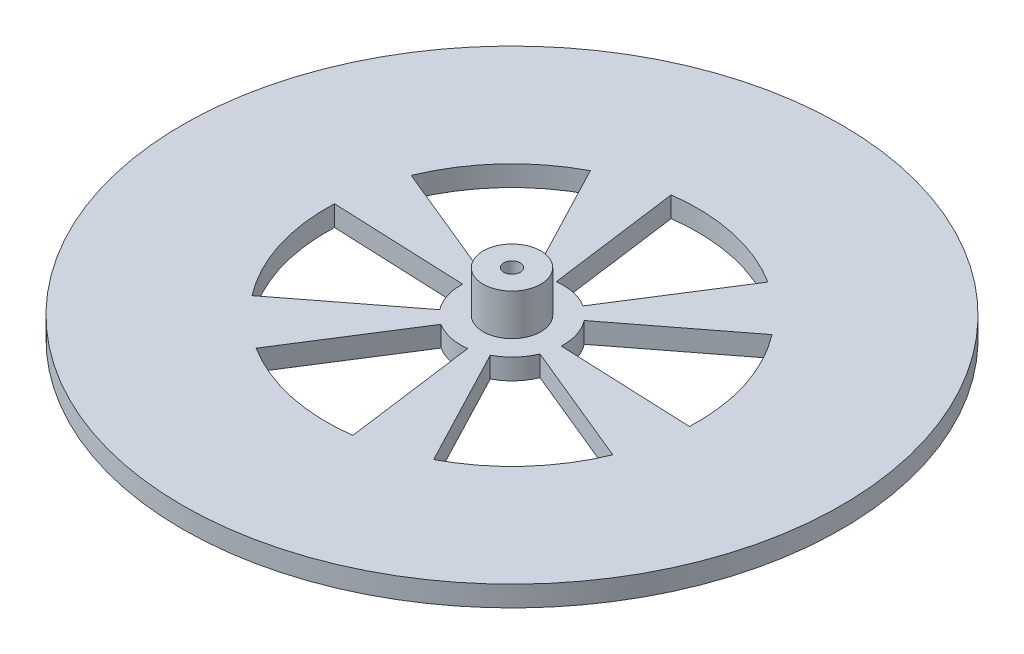
ISO-10303-21;
HEADER;
FILE_DESCRIPTION(('STEP AP214'),'2;1');
FILE_NAME('part.step','',(''),(''),'','','');
FILE_SCHEMA(('AUTOMOTIVE_DESIGN { 1 0 10303 214 1 1 1 1 }'));
ENDSEC;
DATA;
#1=APPLICATION_CONTEXT('core data for automotive mechanical design processes');
#2=APPLICATION_PROTOCOL_DEFINITION('international standard','automotive_design',2000,#1);
#3=PRODUCT_CONTEXT('',#1,'mechanical');
#4=PRODUCT('Part','Part','',(#3));
#5=PRODUCT_RELATED_PRODUCT_CATEGORY('part','',(#4));
#6=PRODUCT_DEFINITION_FORMATION('','',#4);
#7=PRODUCT_DEFINITION_CONTEXT('part definition',#1,'design');
#8=PRODUCT_DEFINITION('design','',#6,#7);
#9=PRODUCT_DEFINITION_SHAPE('','',#8);
#10=(LENGTH_UNIT() NAMED_UNIT(*) SI_UNIT(.MILLI.,.METRE.));
#11=(NAMED_UNIT(*) PLANE_ANGLE_UNIT() SI_UNIT($,.RADIAN.));
#12=(NAMED_UNIT(*) SI_UNIT($,.STERADIAN.) SOLID_ANGLE_UNIT());
#13=UNCERTAINTY_MEASURE_WITH_UNIT(LENGTH_MEASURE(1.E-05),#10,'distance_accuracy_value','');
#14=(GEOMETRIC_REPRESENTATION_CONTEXT(3) GLOBAL_UNCERTAINTY_ASSIGNED_CONTEXT((#13)) GLOBAL_UNIT_ASSIGNED_CONTEXT((#10,
#11,#12)) REPRESENTATION_CONTEXT('',''));
#15=CARTESIAN_POINT('',(0.,0.,0.));
#16=DIRECTION('',(0.,0.,1.));
#17=DIRECTION('',(1.,0.,0.));
#18=AXIS2_PLACEMENT_3D('',#15,#16,#17);
#19=CARTESIAN_POINT('',(0.,5.,0.));
#20=DIRECTION('',(0.,-1.,0.));
#21=DIRECTION('',(0.,0.,-1.));
#22=AXIS2_PLACEMENT_3D('',#19,#20,#21);
#23=CYLINDRICAL_SURFACE('',#22,80.);
#24=CARTESIAN_POINT('',(0.,5.,0.));
#25=DIRECTION('',(0.,1.,0.));
#26=DIRECTION('',(0.,0.,1.));
#27=AXIS2_PLACEMENT_3D('',#24,#25,#26);
#28=CIRCLE('',#27,80.);
#29=CARTESIAN_POINT('',(0.,5.,80.));
#30=VERTEX_POINT('',#29);
#31=EDGE_CURVE('E44',#30,#30,#28,.T.);
#32=ORIENTED_EDGE('',*,*,#31,.F.);
#33=EDGE_LOOP('',(#32));
#34=FACE_BOUND('',#33,.T.);
#35=CARTESIAN_POINT('',(0.,0.,0.));
#36=DIRECTION('',(0.,1.,0.));
#37=DIRECTION('',(0.,0.,1.));
#38=AXIS2_PLACEMENT_3D('',#35,#36,#37);
#39=CIRCLE('',#38,80.);
#40=CARTESIAN_POINT('',(0.,0.,80.));
#41=VERTEX_POINT('',#40);
#42=EDGE_CURVE('E394',#41,#41,#39,.T.);
#43=ORIENTED_EDGE('',*,*,#42,.T.);
#44=EDGE_LOOP('',(#43));
#45=FACE_BOUND('',#44,.T.);
#46=ADVANCED_FACE('F37',(#34,#45),#23,.T.);
#47=CARTESIAN_POINT('',(0.,5.,0.));
#48=DIRECTION('',(0.,1.,0.));
#49=DIRECTION('',(0.,0.,1.));
#50=AXIS2_PLACEMENT_3D('',#47,#48,#49);
#51=PLANE('',#50);
#52=CARTESIAN_POINT('',(0.,5.,0.));
#53=DIRECTION('',(0.,1.,0.));
#54=DIRECTION('',(0.,0.,1.));
#55=AXIS2_PLACEMENT_3D('',#52,#53,#54);
#56=CIRCLE('',#55,7.);
#57=CARTESIAN_POINT('',(0.,5.,7.));
#58=VERTEX_POINT('',#57);
#59=EDGE_CURVE('E228',#58,#58,#56,.T.);
#60=ORIENTED_EDGE('',*,*,#59,.F.);
#61=EDGE_LOOP('',(#60));
#62=FACE_BOUND('',#61,.T.);
#63=CARTESIAN_POINT('',(-1.30924006846535E-12,5.,4.21924539447631E-13));
#64=DIRECTION('',(0.,1.,0.));
#65=DIRECTION('',(-0.866025403784443,0.,-0.499999999999992));
#66=AXIS2_PLACEMENT_3D('',#63,#64,#65);
#67=CIRCLE('',#66,45.0000000000013);
#68=CARTESIAN_POINT('',(44.9608544646638,5.,1.87658354658616));
#69=VERTEX_POINT('',#68);
#70=CARTESIAN_POINT('',(35.648257372824,5.,-27.4627337728948));
#71=VERTEX_POINT('',#70);
#72=EDGE_CURVE('E51',#69,#71,#67,.T.);
#73=ORIENTED_EDGE('',*,*,#72,.F.);
#74=DIRECTION('',(0.999130099214752,0.,0.0417018565908037));
#75=VECTOR('',#74,1.);
#76=CARTESIAN_POINT('',(44.9608544646638,5.,1.87658354658616));
#77=LINE('',#76,#75);
#78=CARTESIAN_POINT('',(12.4891262401844,5.,0.52127320738505));
#79=VERTEX_POINT('',#78);
#80=EDGE_CURVE('E312',#79,#69,#77,.T.);
#81=ORIENTED_EDGE('',*,*,#80,.F.);
#82=CARTESIAN_POINT('',(-2.73442414232397E-13,5.,0.));
#83=DIRECTION('',(0.,-1.,0.));
#84=DIRECTION('',(-0.866025403784443,0.,-0.499999999999992));
#85=AXIS2_PLACEMENT_3D('',#82,#83,#84);
#86=CIRCLE('',#85,12.5000000000003);
#87=CARTESIAN_POINT('',(9.90229371467334,5.,-7.62853715913746));
#88=VERTEX_POINT('',#87);
#89=EDGE_CURVE('E326',#88,#79,#86,.T.);
#90=ORIENTED_EDGE('',*,*,#89,.F.);
#91=DIRECTION('',(-0.792183497173867,0.,0.610282972730996));
#92=VECTOR('',#91,1.);
#93=CARTESIAN_POINT('',(35.648257372824,5.,-27.4627337728948));
#94=LINE('',#93,#92);
#95=EDGE_CURVE('E323',#71,#88,#94,.T.);
#96=ORIENTED_EDGE('',*,*,#95,.F.);
#97=EDGE_LOOP('',(#73,#81,#90,#96));
#98=FACE_BOUND('',#97,.T.);
#99=CARTESIAN_POINT('',(-2.89222664590972E-13,5.,1.34479742866728E-12));
#100=DIRECTION('',(0.,1.,0.));
#101=DIRECTION('',(-0.866025403784433,0.,0.50000000000001));
#102=AXIS2_PLACEMENT_3D('',#99,#100,#101);
#103=CIRCLE('',#102,45.0000000000013);
#104=CARTESIAN_POINT('',(24.1055962559994,5.,-37.9989503689609));
#105=VERTEX_POINT('',#104);
#106=CARTESIAN_POINT('',(-5.95929641828389,5.,-44.6036633719589));
#107=VERTEX_POINT('',#106);
#108=EDGE_CURVE('E59',#105,#107,#103,.T.);
#109=ORIENTED_EDGE('',*,*,#108,.F.);
#110=DIRECTION('',(0.535679916799986,0.,-0.844421119310241));
#111=VECTOR('',#110,1.);
#112=CARTESIAN_POINT('',(24.1055962559994,5.,-37.9989503689609));
#113=LINE('',#112,#111);
#114=CARTESIAN_POINT('',(6.69599895999982,5.,-10.555263991378));
#115=VERTEX_POINT('',#114);
#116=EDGE_CURVE('E281',#115,#105,#113,.T.);
#117=ORIENTED_EDGE('',*,*,#116,.F.);
#118=CARTESIAN_POINT('',(0.,5.,2.81061848561384E-13));
#119=DIRECTION('',(0.,-1.,0.));
#120=DIRECTION('',(-0.866025403784433,0.,0.50000000000001));
#121=AXIS2_PLACEMENT_3D('',#118,#119,#120);
#122=CIRCLE('',#121,12.5000000000003);
#123=CARTESIAN_POINT('',(-1.65536011618997,5.,-12.3899064922108));
#124=VERTEX_POINT('',#123);
#125=EDGE_CURVE('E296',#124,#115,#122,.T.);
#126=ORIENTED_EDGE('',*,*,#125,.F.);
#127=DIRECTION('',(0.132428809295198,0.,0.991192519376865));
#128=VECTOR('',#127,1.);
#129=CARTESIAN_POINT('',(-5.9592964182839,5.,-44.6036633719589));
#130=LINE('',#129,#128);
#131=EDGE_CURVE('E292',#107,#124,#130,.T.);
#132=ORIENTED_EDGE('',*,*,#131,.F.);
#133=EDGE_LOOP('',(#109,#117,#126,#132));
#134=FACE_BOUND('',#133,.T.);
#135=CARTESIAN_POINT('',(2.89222664590981E-13,5.,-1.34479742866728E-12));
#136=DIRECTION('',(0.,1.,0.));
#137=DIRECTION('',(0.866025403784436,0.,-0.500000000000004));
#138=AXIS2_PLACEMENT_3D('',#135,#136,#137);
#139=CIRCLE('',#138,45.0000000000013);
#140=CARTESIAN_POINT('',(-24.1055962559996,5.,37.9989503689607));
#141=VERTEX_POINT('',#140);
#142=CARTESIAN_POINT('',(5.95929641828358,5.,44.603663371959));
#143=VERTEX_POINT('',#142);
#144=EDGE_CURVE('E241',#141,#143,#139,.T.);
#145=ORIENTED_EDGE('',*,*,#144,.F.);
#146=DIRECTION('',(-0.535679916799991,0.,0.844421119310238));
#147=VECTOR('',#146,1.);
#148=CARTESIAN_POINT('',(-24.1055962559996,5.,37.9989503689607));
#149=LINE('',#148,#147);
#150=CARTESIAN_POINT('',(-6.6959989599999,5.,10.555263991378));
#151=VERTEX_POINT('',#150);
#152=EDGE_CURVE('E249',#151,#141,#149,.T.);
#153=ORIENTED_EDGE('',*,*,#152,.F.);
#154=CARTESIAN_POINT('',(0.,5.,-2.81061848561384E-13));
#155=DIRECTION('',(0.,-1.,0.));
#156=DIRECTION('',(0.866025403784436,0.,-0.500000000000004));
#157=AXIS2_PLACEMENT_3D('',#154,#155,#156);
#158=CIRCLE('',#157,12.5000000000003);
#159=CARTESIAN_POINT('',(1.65536011618988,5.,12.3899064922108));
#160=VERTEX_POINT('',#159);
#161=EDGE_CURVE('E263',#160,#151,#158,.T.);
#162=ORIENTED_EDGE('',*,*,#161,.F.);
#163=DIRECTION('',(-0.132428809295191,0.,-0.991192519376866));
#164=VECTOR('',#163,1.);
#165=CARTESIAN_POINT('',(5.95929641828358,5.,44.603663371959));
#166=LINE('',#165,#164);
#167=EDGE_CURVE('E260',#143,#160,#166,.T.);
#168=ORIENTED_EDGE('',*,*,#167,.F.);
#169=EDGE_LOOP('',(#145,#153,#162,#168));
#170=FACE_BOUND('',#169,.T.);
#171=CARTESIAN_POINT('',(-1.02001740387436E-12,5.,-9.22872889219661E-13));
#172=DIRECTION('',(0.,1.,0.));
#173=DIRECTION('',(0.,0.,-1.));
#174=AXIS2_PLACEMENT_3D('',#171,#172,#173);
#175=CIRCLE('',#174,45.0000000000013);
#176=CARTESIAN_POINT('',(20.855258208664,5.,39.8755339155472));
#177=VERTEX_POINT('',#176);
#178=CARTESIAN_POINT('',(41.6075537911076,5.,17.1409295990645));
#179=VERTEX_POINT('',#178);
#180=EDGE_CURVE('E204',#177,#179,#175,.T.);
#181=ORIENTED_EDGE('',*,*,#180,.F.);
#182=DIRECTION('',(0.463450182414756,0.,0.886122975901048));
#183=VECTOR('',#182,1.);
#184=CARTESIAN_POINT('',(20.855258208664,5.,39.8755339155472));
#185=LINE('',#184,#183);
#186=CARTESIAN_POINT('',(5.79312728018445,5.,11.0765371987631));
#187=VERTEX_POINT('',#186);
#188=EDGE_CURVE('E222',#187,#177,#185,.T.);
#189=ORIENTED_EDGE('',*,*,#188,.F.);
#190=CARTESIAN_POINT('',(-2.13370987545147E-13,5.,-1.92554305833426E-13));
#191=DIRECTION('',(0.,-1.,0.));
#192=DIRECTION('',(0.,0.,-1.));
#193=AXIS2_PLACEMENT_3D('',#190,#191,#192);
#194=CIRCLE('',#193,12.5000000000003);
#195=CARTESIAN_POINT('',(11.5576538308632,5.,4.76136933307346));
#196=VERTEX_POINT('',#195);
#197=EDGE_CURVE('E225',#196,#187,#194,.T.);
#198=ORIENTED_EDGE('',*,*,#197,.F.);
#199=DIRECTION('',(-0.924612306469059,0.,-0.380909546645877));
#200=VECTOR('',#199,1.);
#201=CARTESIAN_POINT('',(41.6075537911076,5.,17.1409295990645));
#202=LINE('',#201,#200);
#203=EDGE_CURVE('E234',#179,#196,#202,.T.);
#204=ORIENTED_EDGE('',*,*,#203,.F.);
#205=EDGE_LOOP('',(#181,#189,#198,#204));
#206=FACE_BOUND('',#205,.T.);
#207=CARTESIAN_POINT('',(1.30924006846535E-12,5.,-4.21924539447622E-13));
#208=DIRECTION('',(0.,1.,0.));
#209=DIRECTION('',(0.86602540378444,0.,0.499999999999998));
#210=AXIS2_PLACEMENT_3D('',#207,#208,#209);
#211=CIRCLE('',#210,45.0000000000013);
#212=CARTESIAN_POINT('',(-44.9608544646638,5.,-1.87658354658648));
#213=VERTEX_POINT('',#212);
#214=CARTESIAN_POINT('',(-35.6482573728242,5.,27.4627337728946));
#215=VERTEX_POINT('',#214);
#216=EDGE_CURVE('E270',#213,#215,#211,.T.);
#217=ORIENTED_EDGE('',*,*,#216,.F.);
#218=DIRECTION('',(-0.999130099214752,0.,-0.0417018565908106));
#219=VECTOR('',#218,1.);
#220=CARTESIAN_POINT('',(-44.9608544646638,5.,-1.87658354658648));
#221=LINE('',#220,#219);
#222=CARTESIAN_POINT('',(-12.4891262401844,5.,-0.521273207385137));
#223=VERTEX_POINT('',#222);
#224=EDGE_CURVE('E341',#223,#213,#221,.T.);
#225=ORIENTED_EDGE('',*,*,#224,.F.);
#226=CARTESIAN_POINT('',(2.73442414232398E-13,5.,0.));
#227=DIRECTION('',(0.,-1.,0.));
#228=DIRECTION('',(0.86602540378444,0.,0.499999999999998));
#229=AXIS2_PLACEMENT_3D('',#226,#227,#228);
#230=CIRCLE('',#229,12.5000000000003);
#231=CARTESIAN_POINT('',(-9.90229371467339,5.,7.62853715913739));
#232=VERTEX_POINT('',#231);
#233=EDGE_CURVE('E355',#232,#223,#230,.T.);
#234=ORIENTED_EDGE('',*,*,#233,.F.);
#235=DIRECTION('',(0.792183497173871,0.,-0.610282972730991));
#236=VECTOR('',#235,1.);
#237=CARTESIAN_POINT('',(-35.6482573728242,5.,27.4627337728946));
#238=LINE('',#237,#236);
#239=EDGE_CURVE('E352',#215,#232,#238,.T.);
#240=ORIENTED_EDGE('',*,*,#239,.F.);
#241=EDGE_LOOP('',(#217,#225,#234,#240));
#242=FACE_BOUND('',#241,.T.);
#243=CARTESIAN_POINT('',(1.02001740387436E-12,5.,9.22872889219661E-13));
#244=DIRECTION('',(0.,1.,0.));
#245=DIRECTION('',(0.,0.,1.));
#246=AXIS2_PLACEMENT_3D('',#243,#244,#245);
#247=CIRCLE('',#246,45.0000000000013);
#248=CARTESIAN_POINT('',(-20.855258208664,5.,-39.8755339155472));
#249=VERTEX_POINT('',#248);
#250=CARTESIAN_POINT('',(-41.6075537911076,5.,-17.1409295990645));
#251=VERTEX_POINT('',#250);
#252=EDGE_CURVE('E362',#249,#251,#247,.T.);
#253=ORIENTED_EDGE('',*,*,#252,.F.);
#254=DIRECTION('',(-0.463450182414756,0.,-0.886122975901048));
#255=VECTOR('',#254,1.);
#256=CARTESIAN_POINT('',(-20.855258208664,5.,-39.8755339155472));
#257=LINE('',#256,#255);
#258=CARTESIAN_POINT('',(-5.79312728018445,5.,-11.0765371987631));
#259=VERTEX_POINT('',#258);
#260=EDGE_CURVE('E373',#259,#249,#257,.T.);
#261=ORIENTED_EDGE('',*,*,#260,.F.);
#262=CARTESIAN_POINT('',(2.13370987545147E-13,5.,1.92554305833426E-13));
#263=DIRECTION('',(0.,-1.,0.));
#264=DIRECTION('',(0.,0.,1.));
#265=AXIS2_PLACEMENT_3D('',#262,#263,#264);
#266=CIRCLE('',#265,12.5000000000003);
#267=CARTESIAN_POINT('',(-11.5576538308632,5.,-4.76136933307346));
#268=VERTEX_POINT('',#267);
#269=EDGE_CURVE('E387',#268,#259,#266,.T.);
#270=ORIENTED_EDGE('',*,*,#269,.F.);
#271=DIRECTION('',(0.924612306469059,0.,0.380909546645877));
#272=VECTOR('',#271,1.);
#273=CARTESIAN_POINT('',(-41.6075537911076,5.,-17.1409295990645));
#274=LINE('',#273,#272);
#275=EDGE_CURVE('E384',#251,#268,#274,.T.);
#276=ORIENTED_EDGE('',*,*,#275,.F.);
#277=EDGE_LOOP('',(#253,#261,#270,#276));
#278=FACE_BOUND('',#277,.T.);
#279=ORIENTED_EDGE('',*,*,#31,.T.);
#280=EDGE_LOOP('',(#279));
#281=FACE_BOUND('',#280,.T.);
#282=ADVANCED_FACE('F408',(#62,#98,#134,#170,#206,#242,#278,#281),#51,.T.);
#283=CARTESIAN_POINT('',(0.,0.,0.));
#284=DIRECTION('',(0.,1.,0.));
#285=DIRECTION('',(0.,0.,1.));
#286=AXIS2_PLACEMENT_3D('',#283,#284,#285);
#287=PLANE('',#286);
#288=DIRECTION('',(0.999130099214752,0.,0.0417018565908037));
#289=VECTOR('',#288,1.);
#290=CARTESIAN_POINT('',(44.9608544646638,0.,1.87658354658616));
#291=LINE('',#290,#289);
#292=CARTESIAN_POINT('',(12.4891262401844,0.,0.52127320738505));
#293=VERTEX_POINT('',#292);
#294=CARTESIAN_POINT('',(44.9608544646638,0.,1.87658354658616));
#295=VERTEX_POINT('',#294);
#296=EDGE_CURVE('E318',#293,#295,#291,.T.);
#297=ORIENTED_EDGE('',*,*,#296,.T.);
#298=CARTESIAN_POINT('',(-1.30924006846535E-12,0.,4.21924539447631E-13));
#299=DIRECTION('',(0.,1.,0.));
#300=DIRECTION('',(-0.866025403784443,0.,-0.499999999999992));
#301=AXIS2_PLACEMENT_3D('',#298,#299,#300);
#302=CIRCLE('',#301,45.0000000000013);
#303=CARTESIAN_POINT('',(35.648257372824,0.,-27.4627337728948));
#304=VERTEX_POINT('',#303);
#305=EDGE_CURVE('E308',#295,#304,#302,.T.);
#306=ORIENTED_EDGE('',*,*,#305,.T.);
#307=DIRECTION('',(-0.792183497173867,0.,0.610282972730996));
#308=VECTOR('',#307,1.);
#309=CARTESIAN_POINT('',(35.648257372824,0.,-27.4627337728948));
#310=LINE('',#309,#308);
#311=CARTESIAN_POINT('',(9.90229371467334,0.,-7.62853715913745));
#312=VERTEX_POINT('',#311);
#313=EDGE_CURVE('E311',#304,#312,#310,.T.);
#314=ORIENTED_EDGE('',*,*,#313,.T.);
#315=CARTESIAN_POINT('',(-2.73442414232397E-13,0.,0.));
#316=DIRECTION('',(0.,-1.,0.));
#317=DIRECTION('',(-0.866025403784443,0.,-0.499999999999992));
#318=AXIS2_PLACEMENT_3D('',#315,#316,#317);
#319=CIRCLE('',#318,12.5000000000003);
#320=EDGE_CURVE('E315',#312,#293,#319,.T.);
#321=ORIENTED_EDGE('',*,*,#320,.T.);
#322=EDGE_LOOP('',(#297,#306,#314,#321));
#323=FACE_BOUND('',#322,.T.);
#324=DIRECTION('',(0.535679916799986,0.,-0.844421119310241));
#325=VECTOR('',#324,1.);
#326=CARTESIAN_POINT('',(24.1055962559994,0.,-37.9989503689609));
#327=LINE('',#326,#325);
#328=CARTESIAN_POINT('',(6.69599895999982,0.,-10.555263991378));
#329=VERTEX_POINT('',#328);
#330=CARTESIAN_POINT('',(24.1055962559994,0.,-37.9989503689609));
#331=VERTEX_POINT('',#330);
#332=EDGE_CURVE('E287',#329,#331,#327,.T.);
#333=ORIENTED_EDGE('',*,*,#332,.T.);
#334=CARTESIAN_POINT('',(-2.89222664590972E-13,0.,1.34479742866728E-12));
#335=DIRECTION('',(0.,1.,0.));
#336=DIRECTION('',(-0.866025403784433,0.,0.50000000000001));
#337=AXIS2_PLACEMENT_3D('',#334,#335,#336);
#338=CIRCLE('',#337,45.0000000000013);
#339=CARTESIAN_POINT('',(-5.9592964182839,0.,-44.6036633719589));
#340=VERTEX_POINT('',#339);
#341=EDGE_CURVE('E277',#331,#340,#338,.T.);
#342=ORIENTED_EDGE('',*,*,#341,.T.);
#343=DIRECTION('',(0.132428809295198,0.,0.991192519376865));
#344=VECTOR('',#343,1.);
#345=CARTESIAN_POINT('',(-5.9592964182839,0.,-44.6036633719589));
#346=LINE('',#345,#344);
#347=CARTESIAN_POINT('',(-1.65536011618997,0.,-12.3899064922108));
#348=VERTEX_POINT('',#347);
#349=EDGE_CURVE('E280',#340,#348,#346,.T.);
#350=ORIENTED_EDGE('',*,*,#349,.T.);
#351=CARTESIAN_POINT('',(0.,0.,2.81061848561384E-13));
#352=DIRECTION('',(0.,-1.,0.));
#353=DIRECTION('',(-0.866025403784433,0.,0.50000000000001));
#354=AXIS2_PLACEMENT_3D('',#351,#352,#353);
#355=CIRCLE('',#354,12.5000000000003);
#356=EDGE_CURVE('E284',#348,#329,#355,.T.);
#357=ORIENTED_EDGE('',*,*,#356,.T.);
#358=EDGE_LOOP('',(#333,#342,#350,#357));
#359=FACE_BOUND('',#358,.T.);
#360=DIRECTION('',(-0.535679916799991,0.,0.844421119310238));
#361=VECTOR('',#360,1.);
#362=CARTESIAN_POINT('',(-24.1055962559996,0.,37.9989503689607));
#363=LINE('',#362,#361);
#364=CARTESIAN_POINT('',(-6.6959989599999,0.,10.555263991378));
#365=VERTEX_POINT('',#364);
#366=CARTESIAN_POINT('',(-24.1055962559996,0.,37.9989503689607));
#367=VERTEX_POINT('',#366);
#368=EDGE_CURVE('E255',#365,#367,#363,.T.);
#369=ORIENTED_EDGE('',*,*,#368,.T.);
#370=CARTESIAN_POINT('',(2.89222664590981E-13,0.,-1.34479742866728E-12));
#371=DIRECTION('',(0.,1.,0.));
#372=DIRECTION('',(0.866025403784436,0.,-0.500000000000004));
#373=AXIS2_PLACEMENT_3D('',#370,#371,#372);
#374=CIRCLE('',#373,45.0000000000013);
#375=CARTESIAN_POINT('',(5.95929641828358,0.,44.603663371959));
#376=VERTEX_POINT('',#375);
#377=EDGE_CURVE('E245',#367,#376,#374,.T.);
#378=ORIENTED_EDGE('',*,*,#377,.T.);
#379=DIRECTION('',(-0.132428809295191,0.,-0.991192519376866));
#380=VECTOR('',#379,1.);
#381=CARTESIAN_POINT('',(5.95929641828358,0.,44.603663371959));
#382=LINE('',#381,#380);
#383=CARTESIAN_POINT('',(1.65536011618988,0.,12.3899064922108));
#384=VERTEX_POINT('',#383);
#385=EDGE_CURVE('E248',#376,#384,#382,.T.);
#386=ORIENTED_EDGE('',*,*,#385,.T.);
#387=CARTESIAN_POINT('',(0.,0.,-2.81061848561384E-13));
#388=DIRECTION('',(0.,-1.,0.));
#389=DIRECTION('',(0.866025403784436,0.,-0.500000000000004));
#390=AXIS2_PLACEMENT_3D('',#387,#388,#389);
#391=CIRCLE('',#390,12.5000000000003);
#392=EDGE_CURVE('E252',#384,#365,#391,.T.);
#393=ORIENTED_EDGE('',*,*,#392,.T.);
#394=EDGE_LOOP('',(#369,#378,#386,#393));
#395=FACE_BOUND('',#394,.T.);
#396=DIRECTION('',(0.463450182414756,0.,0.886122975901048));
#397=VECTOR('',#396,1.);
#398=CARTESIAN_POINT('',(20.855258208664,0.,39.8755339155472));
#399=LINE('',#398,#397);
#400=CARTESIAN_POINT('',(5.79312728018445,0.,11.0765371987631));
#401=VERTEX_POINT('',#400);
#402=CARTESIAN_POINT('',(20.855258208664,0.,39.8755339155472));
#403=VERTEX_POINT('',#402);
#404=EDGE_CURVE('E209',#401,#403,#399,.T.);
#405=ORIENTED_EDGE('',*,*,#404,.T.);
#406=CARTESIAN_POINT('',(-1.02001740387436E-12,0.,-9.22872889219661E-13));
#407=DIRECTION('',(0.,1.,0.));
#408=DIRECTION('',(0.,0.,-1.));
#409=AXIS2_PLACEMENT_3D('',#406,#407,#408);
#410=CIRCLE('',#409,45.0000000000013);
#411=CARTESIAN_POINT('',(41.6075537911076,0.,17.1409295990645));
#412=VERTEX_POINT('',#411);
#413=EDGE_CURVE('E201',#403,#412,#410,.T.);
#414=ORIENTED_EDGE('',*,*,#413,.T.);
#415=DIRECTION('',(-0.924612306469059,0.,-0.380909546645877));
#416=VECTOR('',#415,1.);
#417=CARTESIAN_POINT('',(41.6075537911076,0.,17.1409295990645));
#418=LINE('',#417,#416);
#419=CARTESIAN_POINT('',(11.5576538308632,0.,4.76136933307346));
#420=VERTEX_POINT('',#419);
#421=EDGE_CURVE('E213',#412,#420,#418,.T.);
#422=ORIENTED_EDGE('',*,*,#421,.T.);
#423=CARTESIAN_POINT('',(-2.13370987545147E-13,0.,-1.92554305833426E-13));
#424=DIRECTION('',(0.,-1.,0.));
#425=DIRECTION('',(0.,0.,-1.));
#426=AXIS2_PLACEMENT_3D('',#423,#424,#425);
#427=CIRCLE('',#426,12.5000000000003);
#428=EDGE_CURVE('E217',#420,#401,#427,.T.);
#429=ORIENTED_EDGE('',*,*,#428,.T.);
#430=EDGE_LOOP('',(#405,#414,#422,#429));
#431=FACE_BOUND('',#430,.T.);
#432=DIRECTION('',(-0.999130099214752,0.,-0.0417018565908106));
#433=VECTOR('',#432,1.);
#434=CARTESIAN_POINT('',(-44.9608544646638,0.,-1.87658354658648));
#435=LINE('',#434,#433);
#436=CARTESIAN_POINT('',(-12.4891262401844,0.,-0.521273207385137));
#437=VERTEX_POINT('',#436);
#438=CARTESIAN_POINT('',(-44.9608544646638,0.,-1.87658354658648));
#439=VERTEX_POINT('',#438);
#440=EDGE_CURVE('E347',#437,#439,#435,.T.);
#441=ORIENTED_EDGE('',*,*,#440,.T.);
#442=CARTESIAN_POINT('',(1.30924006846535E-12,0.,-4.21924539447622E-13));
#443=DIRECTION('',(0.,1.,0.));
#444=DIRECTION('',(0.86602540378444,0.,0.499999999999998));
#445=AXIS2_PLACEMENT_3D('',#442,#443,#444);
#446=CIRCLE('',#445,45.0000000000013);
#447=CARTESIAN_POINT('',(-35.6482573728242,0.,27.4627337728946));
#448=VERTEX_POINT('',#447);
#449=EDGE_CURVE('E337',#439,#448,#446,.T.);
#450=ORIENTED_EDGE('',*,*,#449,.T.);
#451=DIRECTION('',(0.792183497173871,0.,-0.610282972730991));
#452=VECTOR('',#451,1.);
#453=CARTESIAN_POINT('',(-35.6482573728242,0.,27.4627337728946));
#454=LINE('',#453,#452);
#455=CARTESIAN_POINT('',(-9.90229371467339,0.,7.62853715913738));
#456=VERTEX_POINT('',#455);
#457=EDGE_CURVE('E340',#448,#456,#454,.T.);
#458=ORIENTED_EDGE('',*,*,#457,.T.);
#459=CARTESIAN_POINT('',(2.73442414232398E-13,0.,0.));
#460=DIRECTION('',(0.,-1.,0.));
#461=DIRECTION('',(0.86602540378444,0.,0.499999999999998));
#462=AXIS2_PLACEMENT_3D('',#459,#460,#461);
#463=CIRCLE('',#462,12.5000000000003);
#464=EDGE_CURVE('E344',#456,#437,#463,.T.);
#465=ORIENTED_EDGE('',*,*,#464,.T.);
#466=EDGE_LOOP('',(#441,#450,#458,#465));
#467=FACE_BOUND('',#466,.T.);
#468=DIRECTION('',(-0.463450182414756,0.,-0.886122975901048));
#469=VECTOR('',#468,1.);
#470=CARTESIAN_POINT('',(-20.855258208664,0.,-39.8755339155472));
#471=LINE('',#470,#469);
#472=CARTESIAN_POINT('',(-5.79312728018445,0.,-11.0765371987631));
#473=VERTEX_POINT('',#472);
#474=CARTESIAN_POINT('',(-20.855258208664,0.,-39.8755339155472));
#475=VERTEX_POINT('',#474);
#476=EDGE_CURVE('E379',#473,#475,#471,.T.);
#477=ORIENTED_EDGE('',*,*,#476,.T.);
#478=CARTESIAN_POINT('',(1.02001740387436E-12,0.,9.22872889219661E-13));
#479=DIRECTION('',(0.,1.,0.));
#480=DIRECTION('',(0.,0.,1.));
#481=AXIS2_PLACEMENT_3D('',#478,#479,#480);
#482=CIRCLE('',#481,45.0000000000013);
#483=CARTESIAN_POINT('',(-41.6075537911076,0.,-17.1409295990645));
#484=VERTEX_POINT('',#483);
#485=EDGE_CURVE('E369',#475,#484,#482,.T.);
#486=ORIENTED_EDGE('',*,*,#485,.T.);
#487=DIRECTION('',(0.924612306469059,0.,0.380909546645877));
#488=VECTOR('',#487,1.);
#489=CARTESIAN_POINT('',(-41.6075537911076,0.,-17.1409295990645));
#490=LINE('',#489,#488);
#491=CARTESIAN_POINT('',(-11.5576538308632,0.,-4.76136933307346));
#492=VERTEX_POINT('',#491);
#493=EDGE_CURVE('E372',#484,#492,#490,.T.);
#494=ORIENTED_EDGE('',*,*,#493,.T.);
#495=CARTESIAN_POINT('',(2.13370987545147E-13,0.,1.92554305833426E-13));
#496=DIRECTION('',(0.,-1.,0.));
#497=DIRECTION('',(0.,0.,1.));
#498=AXIS2_PLACEMENT_3D('',#495,#496,#497);
#499=CIRCLE('',#498,12.5000000000003);
#500=EDGE_CURVE('E376',#492,#473,#499,.T.);
#501=ORIENTED_EDGE('',*,*,#500,.T.);
#502=EDGE_LOOP('',(#477,#486,#494,#501));
#503=FACE_BOUND('',#502,.T.);
#504=ORIENTED_EDGE('',*,*,#42,.F.);
#505=EDGE_LOOP('',(#504));
#506=FACE_BOUND('',#505,.T.);
#507=ADVANCED_FACE('F219',(#323,#359,#395,#431,#467,#503,#506),#287,.F.);
#508=CARTESIAN_POINT('',(1.02001740387436E-12,0.,9.22872889219661E-13));
#509=DIRECTION('',(0.,1.,0.));
#510=DIRECTION('',(0.,0.,1.));
#511=AXIS2_PLACEMENT_3D('',#508,#509,#510);
#512=CYLINDRICAL_SURFACE('',#511,45.0000000000013);
#513=ORIENTED_EDGE('',*,*,#252,.T.);
#514=DIRECTION('',(0.,1.,0.));
#515=VECTOR('',#514,1.);
#516=CARTESIAN_POINT('',(-41.6075537911076,0.,-17.1409295990645));
#517=LINE('',#516,#515);
#518=EDGE_CURVE('E382',#484,#251,#517,.T.);
#519=ORIENTED_EDGE('',*,*,#518,.F.);
#520=ORIENTED_EDGE('',*,*,#485,.F.);
#521=DIRECTION('',(0.,1.,0.));
#522=VECTOR('',#521,1.);
#523=CARTESIAN_POINT('',(-20.855258208664,0.,-39.8755339155472));
#524=LINE('',#523,#522);
#525=EDGE_CURVE('E392',#475,#249,#524,.T.);
#526=ORIENTED_EDGE('',*,*,#525,.T.);
#527=EDGE_LOOP('',(#513,#519,#520,#526));
#528=FACE_BOUND('',#527,.T.);
#529=ADVANCED_FACE('F407',(#528),#512,.F.);
#530=CARTESIAN_POINT('',(-20.855258208664,0.,-39.8755339155472));
#531=DIRECTION('',(0.886122975901048,0.,-0.463450182414756));
#532=DIRECTION('',(-0.463450182414756,0.,-0.886122975901048));
#533=AXIS2_PLACEMENT_3D('',#530,#531,#532);
#534=PLANE('',#533);
#535=ORIENTED_EDGE('',*,*,#260,.T.);
#536=ORIENTED_EDGE('',*,*,#525,.F.);
#537=ORIENTED_EDGE('',*,*,#476,.F.);
#538=DIRECTION('',(0.,1.,0.));
#539=VECTOR('',#538,1.);
#540=CARTESIAN_POINT('',(-5.79312728018445,0.,-11.0765371987631));
#541=LINE('',#540,#539);
#542=EDGE_CURVE('E395',#473,#259,#541,.T.);
#543=ORIENTED_EDGE('',*,*,#542,.T.);
#544=EDGE_LOOP('',(#535,#536,#537,#543));
#545=FACE_BOUND('',#544,.T.);
#546=ADVANCED_FACE('F414',(#545),#534,.F.);
#547=CARTESIAN_POINT('',(2.13370987545147E-13,0.,1.92554305833426E-13));
#548=DIRECTION('',(0.,1.,0.));
#549=DIRECTION('',(0.,0.,1.));
#550=AXIS2_PLACEMENT_3D('',#547,#548,#549);
#551=CYLINDRICAL_SURFACE('',#550,12.5000000000003);
#552=ORIENTED_EDGE('',*,*,#269,.T.);
#553=ORIENTED_EDGE('',*,*,#542,.F.);
#554=ORIENTED_EDGE('',*,*,#500,.F.);
#555=DIRECTION('',(0.,1.,0.));
#556=VECTOR('',#555,1.);
#557=CARTESIAN_POINT('',(-11.5576538308632,0.,-4.76136933307346));
#558=LINE('',#557,#556);
#559=EDGE_CURVE('E397',#492,#268,#558,.T.);
#560=ORIENTED_EDGE('',*,*,#559,.T.);
#561=EDGE_LOOP('',(#552,#553,#554,#560));
#562=FACE_BOUND('',#561,.T.);
#563=ADVANCED_FACE('F656',(#562),#551,.T.);
#564=CARTESIAN_POINT('',(-41.6075537911076,0.,-17.1409295990645));
#565=DIRECTION('',(-0.380909546645877,0.,0.924612306469059));
#566=DIRECTION('',(0.924612306469059,0.,0.380909546645877));
#567=AXIS2_PLACEMENT_3D('',#564,#565,#566);
#568=PLANE('',#567);
#569=ORIENTED_EDGE('',*,*,#275,.T.);
#570=ORIENTED_EDGE('',*,*,#559,.F.);
#571=ORIENTED_EDGE('',*,*,#493,.F.);
#572=ORIENTED_EDGE('',*,*,#518,.T.);
#573=EDGE_LOOP('',(#569,#570,#571,#572));
#574=FACE_BOUND('',#573,.T.);
#575=ADVANCED_FACE('F647',(#574),#568,.F.);
#576=CARTESIAN_POINT('',(1.30924006846535E-12,0.,-4.21924539447622E-13));
#577=DIRECTION('',(0.,1.,0.));
#578=DIRECTION('',(0.,0.,1.));
#579=AXIS2_PLACEMENT_3D('',#576,#577,#578);
#580=CYLINDRICAL_SURFACE('',#579,45.0000000000013);
#581=ORIENTED_EDGE('',*,*,#216,.T.);
#582=DIRECTION('',(0.,1.,0.));
#583=VECTOR('',#582,1.);
#584=CARTESIAN_POINT('',(-35.6482573728242,0.,27.4627337728946));
#585=LINE('',#584,#583);
#586=EDGE_CURVE('E350',#448,#215,#585,.T.);
#587=ORIENTED_EDGE('',*,*,#586,.F.);
#588=ORIENTED_EDGE('',*,*,#449,.F.);
#589=DIRECTION('',(0.,1.,0.));
#590=VECTOR('',#589,1.);
#591=CARTESIAN_POINT('',(-44.9608544646638,0.,-1.87658354658648));
#592=LINE('',#591,#590);
#593=EDGE_CURVE('E360',#439,#213,#592,.T.);
#594=ORIENTED_EDGE('',*,*,#593,.T.);
#595=EDGE_LOOP('',(#581,#587,#588,#594));
#596=FACE_BOUND('',#595,.T.);
#597=ADVANCED_FACE('F638',(#596),#580,.F.);
#598=CARTESIAN_POINT('',(-44.9608544646638,0.,-1.87658354658648));
#599=DIRECTION('',(0.0417018565908106,0.,-0.999130099214752));
#600=DIRECTION('',(-0.999130099214752,0.,-0.0417018565908106));
#601=AXIS2_PLACEMENT_3D('',#598,#599,#600);
#602=PLANE('',#601);
#603=ORIENTED_EDGE('',*,*,#224,.T.);
#604=ORIENTED_EDGE('',*,*,#593,.F.);
#605=ORIENTED_EDGE('',*,*,#440,.F.);
#606=DIRECTION('',(0.,1.,0.));
#607=VECTOR('',#606,1.);
#608=CARTESIAN_POINT('',(-12.4891262401844,0.,-0.521273207385137));
#609=LINE('',#608,#607);
#610=EDGE_CURVE('E363',#437,#223,#609,.T.);
#611=ORIENTED_EDGE('',*,*,#610,.T.);
#612=EDGE_LOOP('',(#603,#604,#605,#611));
#613=FACE_BOUND('',#612,.T.);
#614=ADVANCED_FACE('F629',(#613),#602,.F.);
#615=CARTESIAN_POINT('',(2.73442414232398E-13,0.,0.));
#616=DIRECTION('',(0.,1.,0.));
#617=DIRECTION('',(0.,0.,1.));
#618=AXIS2_PLACEMENT_3D('',#615,#616,#617);
#619=CYLINDRICAL_SURFACE('',#618,12.5000000000003);
#620=ORIENTED_EDGE('',*,*,#233,.T.);
#621=ORIENTED_EDGE('',*,*,#610,.F.);
#622=ORIENTED_EDGE('',*,*,#464,.F.);
#623=DIRECTION('',(0.,1.,0.));
#624=VECTOR('',#623,1.);
#625=CARTESIAN_POINT('',(-9.90229371467339,0.,7.62853715913739));
#626=LINE('',#625,#624);
#627=EDGE_CURVE('E365',#456,#232,#626,.T.);
#628=ORIENTED_EDGE('',*,*,#627,.T.);
#629=EDGE_LOOP('',(#620,#621,#622,#628));
#630=FACE_BOUND('',#629,.T.);
#631=ADVANCED_FACE('F620',(#630),#619,.T.);
#632=CARTESIAN_POINT('',(-35.6482573728242,0.,27.4627337728946));
#633=DIRECTION('',(0.610282972730991,0.,0.792183497173871));
#634=DIRECTION('',(0.792183497173871,0.,-0.610282972730991));
#635=AXIS2_PLACEMENT_3D('',#632,#633,#634);
#636=PLANE('',#635);
#637=ORIENTED_EDGE('',*,*,#239,.T.);
#638=ORIENTED_EDGE('',*,*,#627,.F.);
#639=ORIENTED_EDGE('',*,*,#457,.F.);
#640=ORIENTED_EDGE('',*,*,#586,.T.);
#641=EDGE_LOOP('',(#637,#638,#639,#640));
#642=FACE_BOUND('',#641,.T.);
#643=ADVANCED_FACE('F612',(#642),#636,.F.);
#644=CARTESIAN_POINT('',(-1.02001740387436E-12,0.,-9.22872889219661E-13));
#645=DIRECTION('',(0.,1.,0.));
#646=DIRECTION('',(0.,0.,1.));
#647=AXIS2_PLACEMENT_3D('',#644,#645,#646);
#648=CYLINDRICAL_SURFACE('',#647,45.0000000000013);
#649=ORIENTED_EDGE('',*,*,#180,.T.);
#650=DIRECTION('',(0.,1.,0.));
#651=VECTOR('',#650,1.);
#652=CARTESIAN_POINT('',(41.6075537911076,0.,17.1409295990645));
#653=LINE('',#652,#651);
#654=EDGE_CURVE('E197',#412,#179,#653,.T.);
#655=ORIENTED_EDGE('',*,*,#654,.F.);
#656=ORIENTED_EDGE('',*,*,#413,.F.);
#657=DIRECTION('',(0.,1.,0.));
#658=VECTOR('',#657,1.);
#659=CARTESIAN_POINT('',(20.855258208664,0.,39.8755339155472));
#660=LINE('',#659,#658);
#661=EDGE_CURVE('E239',#403,#177,#660,.T.);
#662=ORIENTED_EDGE('',*,*,#661,.T.);
#663=EDGE_LOOP('',(#649,#655,#656,#662));
#664=FACE_BOUND('',#663,.T.);
#665=ADVANCED_FACE('F199',(#664),#648,.F.);
#666=CARTESIAN_POINT('',(20.855258208664,0.,39.8755339155472));
#667=DIRECTION('',(-0.886122975901048,0.,0.463450182414756));
#668=DIRECTION('',(0.463450182414756,0.,0.886122975901048));
#669=AXIS2_PLACEMENT_3D('',#666,#667,#668);
#670=PLANE('',#669);
#671=ORIENTED_EDGE('',*,*,#188,.T.);
#672=ORIENTED_EDGE('',*,*,#661,.F.);
#673=ORIENTED_EDGE('',*,*,#404,.F.);
#674=DIRECTION('',(0.,1.,0.));
#675=VECTOR('',#674,1.);
#676=CARTESIAN_POINT('',(5.79312728018445,0.,11.0765371987631));
#677=LINE('',#676,#675);
#678=EDGE_CURVE('E242',#401,#187,#677,.T.);
#679=ORIENTED_EDGE('',*,*,#678,.T.);
#680=EDGE_LOOP('',(#671,#672,#673,#679));
#681=FACE_BOUND('',#680,.T.);
#682=ADVANCED_FACE('F595',(#681),#670,.F.);
#683=CARTESIAN_POINT('',(-2.13370987545147E-13,0.,-1.92554305833426E-13));
#684=DIRECTION('',(0.,1.,0.));
#685=DIRECTION('',(0.,0.,1.));
#686=AXIS2_PLACEMENT_3D('',#683,#684,#685);
#687=CYLINDRICAL_SURFACE('',#686,12.5000000000003);
#688=ORIENTED_EDGE('',*,*,#197,.T.);
#689=ORIENTED_EDGE('',*,*,#678,.F.);
#690=ORIENTED_EDGE('',*,*,#428,.F.);
#691=DIRECTION('',(0.,1.,0.));
#692=VECTOR('',#691,1.);
#693=CARTESIAN_POINT('',(11.5576538308632,0.,4.76136933307346));
#694=LINE('',#693,#692);
#695=EDGE_CURVE('E208',#420,#196,#694,.T.);
#696=ORIENTED_EDGE('',*,*,#695,.T.);
#697=EDGE_LOOP('',(#688,#689,#690,#696));
#698=FACE_BOUND('',#697,.T.);
#699=ADVANCED_FACE('F587',(#698),#687,.T.);
#700=CARTESIAN_POINT('',(41.6075537911076,0.,17.1409295990645));
#701=DIRECTION('',(0.380909546645877,0.,-0.924612306469059));
#702=DIRECTION('',(-0.924612306469059,0.,-0.380909546645877));
#703=AXIS2_PLACEMENT_3D('',#700,#701,#702);
#704=PLANE('',#703);
#705=ORIENTED_EDGE('',*,*,#203,.T.);
#706=ORIENTED_EDGE('',*,*,#695,.F.);
#707=ORIENTED_EDGE('',*,*,#421,.F.);
#708=ORIENTED_EDGE('',*,*,#654,.T.);
#709=EDGE_LOOP('',(#705,#706,#707,#708));
#710=FACE_BOUND('',#709,.T.);
#711=ADVANCED_FACE('F214',(#710),#704,.F.);
#712=CARTESIAN_POINT('',(2.89222664590981E-13,0.,-1.34479742866728E-12));
#713=DIRECTION('',(0.,1.,0.));
#714=DIRECTION('',(0.,0.,1.));
#715=AXIS2_PLACEMENT_3D('',#712,#713,#714);
#716=CYLINDRICAL_SURFACE('',#715,45.0000000000013);
#717=ORIENTED_EDGE('',*,*,#144,.T.);
#718=DIRECTION('',(0.,1.,0.));
#719=VECTOR('',#718,1.);
#720=CARTESIAN_POINT('',(5.95929641828358,0.,44.603663371959));
#721=LINE('',#720,#719);
#722=EDGE_CURVE('E258',#376,#143,#721,.T.);
#723=ORIENTED_EDGE('',*,*,#722,.F.);
#724=ORIENTED_EDGE('',*,*,#377,.F.);
#725=DIRECTION('',(0.,1.,0.));
#726=VECTOR('',#725,1.);
#727=CARTESIAN_POINT('',(-24.1055962559996,0.,37.9989503689607));
#728=LINE('',#727,#726);
#729=EDGE_CURVE('E268',#367,#141,#728,.T.);
#730=ORIENTED_EDGE('',*,*,#729,.T.);
#731=EDGE_LOOP('',(#717,#723,#724,#730));
#732=FACE_BOUND('',#731,.T.);
#733=ADVANCED_FACE('F570',(#732),#716,.F.);
#734=CARTESIAN_POINT('',(-24.1055962559996,0.,37.9989503689607));
#735=DIRECTION('',(-0.844421119310237,0.,-0.535679916799991));
#736=DIRECTION('',(-0.535679916799991,0.,0.844421119310237));
#737=AXIS2_PLACEMENT_3D('',#734,#735,#736);
#738=PLANE('',#737);
#739=ORIENTED_EDGE('',*,*,#152,.T.);
#740=ORIENTED_EDGE('',*,*,#729,.F.);
#741=ORIENTED_EDGE('',*,*,#368,.F.);
#742=DIRECTION('',(0.,1.,0.));
#743=VECTOR('',#742,1.);
#744=CARTESIAN_POINT('',(-6.6959989599999,0.,10.555263991378));
#745=LINE('',#744,#743);
#746=EDGE_CURVE('E271',#365,#151,#745,.T.);
#747=ORIENTED_EDGE('',*,*,#746,.T.);
#748=EDGE_LOOP('',(#739,#740,#741,#747));
#749=FACE_BOUND('',#748,.T.);
#750=ADVANCED_FACE('F561',(#749),#738,.F.);
#751=CARTESIAN_POINT('',(0.,0.,-2.81061848561384E-13));
#752=DIRECTION('',(0.,1.,0.));
#753=DIRECTION('',(0.,0.,1.));
#754=AXIS2_PLACEMENT_3D('',#751,#752,#753);
#755=CYLINDRICAL_SURFACE('',#754,12.5000000000003);
#756=ORIENTED_EDGE('',*,*,#161,.T.);
#757=ORIENTED_EDGE('',*,*,#746,.F.);
#758=ORIENTED_EDGE('',*,*,#392,.F.);
#759=DIRECTION('',(0.,1.,0.));
#760=VECTOR('',#759,1.);
#761=CARTESIAN_POINT('',(1.65536011618988,0.,12.3899064922108));
#762=LINE('',#761,#760);
#763=EDGE_CURVE('E273',#384,#160,#762,.T.);
#764=ORIENTED_EDGE('',*,*,#763,.T.);
#765=EDGE_LOOP('',(#756,#757,#758,#764));
#766=FACE_BOUND('',#765,.T.);
#767=ADVANCED_FACE('F552',(#766),#755,.T.);
#768=CARTESIAN_POINT('',(5.95929641828358,0.,44.603663371959));
#769=DIRECTION('',(0.991192519376866,0.,-0.132428809295191));
#770=DIRECTION('',(-0.132428809295191,0.,-0.991192519376866));
#771=AXIS2_PLACEMENT_3D('',#768,#769,#770);
#772=PLANE('',#771);
#773=ORIENTED_EDGE('',*,*,#167,.T.);
#774=ORIENTED_EDGE('',*,*,#763,.F.);
#775=ORIENTED_EDGE('',*,*,#385,.F.);
#776=ORIENTED_EDGE('',*,*,#722,.T.);
#777=EDGE_LOOP('',(#773,#774,#775,#776));
#778=FACE_BOUND('',#777,.T.);
#779=ADVANCED_FACE('F544',(#778),#772,.F.);
#780=CARTESIAN_POINT('',(-2.89222664590972E-13,0.,1.34479742866728E-12));
#781=DIRECTION('',(0.,1.,0.));
#782=DIRECTION('',(0.,0.,1.));
#783=AXIS2_PLACEMENT_3D('',#780,#781,#782);
#784=CYLINDRICAL_SURFACE('',#783,45.0000000000013);
#785=ORIENTED_EDGE('',*,*,#108,.T.);
#786=DIRECTION('',(0.,1.,0.));
#787=VECTOR('',#786,1.);
#788=CARTESIAN_POINT('',(-5.9592964182839,0.,-44.6036633719589));
#789=LINE('',#788,#787);
#790=EDGE_CURVE('E290',#340,#107,#789,.T.);
#791=ORIENTED_EDGE('',*,*,#790,.F.);
#792=ORIENTED_EDGE('',*,*,#341,.F.);
#793=DIRECTION('',(0.,1.,0.));
#794=VECTOR('',#793,1.);
#795=CARTESIAN_POINT('',(24.1055962559994,0.,-37.9989503689609));
#796=LINE('',#795,#794);
#797=EDGE_CURVE('E301',#331,#105,#796,.T.);
#798=ORIENTED_EDGE('',*,*,#797,.T.);
#799=EDGE_LOOP('',(#785,#791,#792,#798));
#800=FACE_BOUND('',#799,.T.);
#801=ADVANCED_FACE('F535',(#800),#784,.F.);
#802=CARTESIAN_POINT('',(24.1055962559994,0.,-37.9989503689609));
#803=DIRECTION('',(0.844421119310241,0.,0.535679916799985));
#804=DIRECTION('',(0.535679916799985,0.,-0.844421119310241));
#805=AXIS2_PLACEMENT_3D('',#802,#803,#804);
#806=PLANE('',#805);
#807=ORIENTED_EDGE('',*,*,#116,.T.);
#808=ORIENTED_EDGE('',*,*,#797,.F.);
#809=ORIENTED_EDGE('',*,*,#332,.F.);
#810=DIRECTION('',(0.,1.,0.));
#811=VECTOR('',#810,1.);
#812=CARTESIAN_POINT('',(6.69599895999982,0.,-10.555263991378));
#813=LINE('',#812,#811);
#814=EDGE_CURVE('E303',#329,#115,#813,.T.);
#815=ORIENTED_EDGE('',*,*,#814,.T.);
#816=EDGE_LOOP('',(#807,#808,#809,#815));
#817=FACE_BOUND('',#816,.T.);
#818=ADVANCED_FACE('F526',(#817),#806,.F.);
#819=CARTESIAN_POINT('',(0.,0.,2.81061848561384E-13));
#820=DIRECTION('',(0.,1.,0.));
#821=DIRECTION('',(0.,0.,1.));
#822=AXIS2_PLACEMENT_3D('',#819,#820,#821);
#823=CYLINDRICAL_SURFACE('',#822,12.5000000000003);
#824=ORIENTED_EDGE('',*,*,#125,.T.);
#825=ORIENTED_EDGE('',*,*,#814,.F.);
#826=ORIENTED_EDGE('',*,*,#356,.F.);
#827=DIRECTION('',(0.,1.,0.));
#828=VECTOR('',#827,1.);
#829=CARTESIAN_POINT('',(-1.65536011618997,0.,-12.3899064922108));
#830=LINE('',#829,#828);
#831=EDGE_CURVE('E305',#348,#124,#830,.T.);
#832=ORIENTED_EDGE('',*,*,#831,.T.);
#833=EDGE_LOOP('',(#824,#825,#826,#832));
#834=FACE_BOUND('',#833,.T.);
#835=ADVANCED_FACE('F517',(#834),#823,.T.);
#836=CARTESIAN_POINT('',(-5.9592964182839,0.,-44.6036633719589));
#837=DIRECTION('',(-0.991192519376865,0.,0.132428809295198));
#838=DIRECTION('',(0.132428809295198,0.,0.991192519376865));
#839=AXIS2_PLACEMENT_3D('',#836,#837,#838);
#840=PLANE('',#839);
#841=ORIENTED_EDGE('',*,*,#131,.T.);
#842=ORIENTED_EDGE('',*,*,#831,.F.);
#843=ORIENTED_EDGE('',*,*,#349,.F.);
#844=ORIENTED_EDGE('',*,*,#790,.T.);
#845=EDGE_LOOP('',(#841,#842,#843,#844));
#846=FACE_BOUND('',#845,.T.);
#847=ADVANCED_FACE('F509',(#846),#840,.F.);
#848=CARTESIAN_POINT('',(-1.30924006846535E-12,0.,4.21924539447631E-13));
#849=DIRECTION('',(0.,1.,0.));
#850=DIRECTION('',(0.,0.,1.));
#851=AXIS2_PLACEMENT_3D('',#848,#849,#850);
#852=CYLINDRICAL_SURFACE('',#851,45.0000000000013);
#853=ORIENTED_EDGE('',*,*,#72,.T.);
#854=DIRECTION('',(0.,1.,0.));
#855=VECTOR('',#854,1.);
#856=CARTESIAN_POINT('',(35.648257372824,0.,-27.4627337728948));
#857=LINE('',#856,#855);
#858=EDGE_CURVE('E321',#304,#71,#857,.T.);
#859=ORIENTED_EDGE('',*,*,#858,.F.);
#860=ORIENTED_EDGE('',*,*,#305,.F.);
#861=DIRECTION('',(0.,1.,0.));
#862=VECTOR('',#861,1.);
#863=CARTESIAN_POINT('',(44.9608544646638,0.,1.87658354658616));
#864=LINE('',#863,#862);
#865=EDGE_CURVE('E235',#295,#69,#864,.T.);
#866=ORIENTED_EDGE('',*,*,#865,.T.);
#867=EDGE_LOOP('',(#853,#859,#860,#866));
#868=FACE_BOUND('',#867,.T.);
#869=ADVANCED_FACE('F500',(#868),#852,.F.);
#870=CARTESIAN_POINT('',(44.9608544646638,0.,1.87658354658616));
#871=DIRECTION('',(-0.0417018565908037,0.,0.999130099214752));
#872=DIRECTION('',(0.999130099214752,0.,0.0417018565908037));
#873=AXIS2_PLACEMENT_3D('',#870,#871,#872);
#874=PLANE('',#873);
#875=ORIENTED_EDGE('',*,*,#80,.T.);
#876=ORIENTED_EDGE('',*,*,#865,.F.);
#877=ORIENTED_EDGE('',*,*,#296,.F.);
#878=DIRECTION('',(0.,1.,0.));
#879=VECTOR('',#878,1.);
#880=CARTESIAN_POINT('',(12.4891262401844,0.,0.52127320738505));
#881=LINE('',#880,#879);
#882=EDGE_CURVE('E332',#293,#79,#881,.T.);
#883=ORIENTED_EDGE('',*,*,#882,.T.);
#884=EDGE_LOOP('',(#875,#876,#877,#883));
#885=FACE_BOUND('',#884,.T.);
#886=ADVANCED_FACE('F491',(#885),#874,.F.);
#887=CARTESIAN_POINT('',(-2.73442414232397E-13,0.,0.));
#888=DIRECTION('',(0.,1.,0.));
#889=DIRECTION('',(0.,0.,1.));
#890=AXIS2_PLACEMENT_3D('',#887,#888,#889);
#891=CYLINDRICAL_SURFACE('',#890,12.5000000000003);
#892=ORIENTED_EDGE('',*,*,#89,.T.);
#893=ORIENTED_EDGE('',*,*,#882,.F.);
#894=ORIENTED_EDGE('',*,*,#320,.F.);
#895=DIRECTION('',(0.,1.,0.));
#896=VECTOR('',#895,1.);
#897=CARTESIAN_POINT('',(9.90229371467334,0.,-7.62853715913746));
#898=LINE('',#897,#896);
#899=EDGE_CURVE('E334',#312,#88,#898,.T.);
#900=ORIENTED_EDGE('',*,*,#899,.T.);
#901=EDGE_LOOP('',(#892,#893,#894,#900));
#902=FACE_BOUND('',#901,.T.);
#903=ADVANCED_FACE('F484',(#902),#891,.T.);
#904=CARTESIAN_POINT('',(35.648257372824,0.,-27.4627337728948));
#905=DIRECTION('',(-0.610282972730996,0.,-0.792183497173867));
#906=DIRECTION('',(-0.792183497173867,0.,0.610282972730996));
#907=AXIS2_PLACEMENT_3D('',#904,#905,#906);
#908=PLANE('',#907);
#909=ORIENTED_EDGE('',*,*,#95,.T.);
#910=ORIENTED_EDGE('',*,*,#899,.F.);
#911=ORIENTED_EDGE('',*,*,#313,.F.);
#912=ORIENTED_EDGE('',*,*,#858,.T.);
#913=EDGE_LOOP('',(#909,#910,#911,#912));
#914=FACE_BOUND('',#913,.T.);
#915=ADVANCED_FACE('F439',(#914),#908,.F.);
#916=CARTESIAN_POINT('',(0.,15.,0.));
#917=DIRECTION('',(0.,1.,0.));
#918=DIRECTION('',(0.,0.,1.));
#919=AXIS2_PLACEMENT_3D('',#916,#917,#918);
#920=PLANE('',#919);
#921=CARTESIAN_POINT('',(0.,15.,0.));
#922=DIRECTION('',(0.,1.,0.));
#923=DIRECTION('',(0.,0.,1.));
#924=AXIS2_PLACEMENT_3D('',#921,#922,#923);
#925=CIRCLE('',#924,7.);
#926=CARTESIAN_POINT('',(0.,15.,7.));
#927=VERTEX_POINT('',#926);
#928=EDGE_CURVE('E293',#927,#927,#925,.T.);
#929=ORIENTED_EDGE('',*,*,#928,.T.);
#930=EDGE_LOOP('',(#929));
#931=FACE_BOUND('',#930,.T.);
#932=CARTESIAN_POINT('',(0.,15.,0.));
#933=DIRECTION('',(0.,1.,0.));
#934=DIRECTION('',(0.,0.,1.));
#935=AXIS2_PLACEMENT_3D('',#932,#933,#934);
#936=CIRCLE('',#935,2.);
#937=CARTESIAN_POINT('',(0.,15.,2.));
#938=VERTEX_POINT('',#937);
#939=EDGE_CURVE('E758',#938,#938,#936,.T.);
#940=ORIENTED_EDGE('',*,*,#939,.F.);
#941=EDGE_LOOP('',(#940));
#942=FACE_BOUND('',#941,.T.);
#943=ADVANCED_FACE('F444',(#931,#942),#920,.T.);
#944=CARTESIAN_POINT('',(0.,15.,0.));
#945=DIRECTION('',(0.,-1.,0.));
#946=DIRECTION('',(0.,0.,-1.));
#947=AXIS2_PLACEMENT_3D('',#944,#945,#946);
#948=CYLINDRICAL_SURFACE('',#947,7.);
#949=ORIENTED_EDGE('',*,*,#928,.F.);
#950=EDGE_LOOP('',(#949));
#951=FACE_BOUND('',#950,.T.);
#952=ORIENTED_EDGE('',*,*,#59,.T.);
#953=EDGE_LOOP('',(#952));
#954=FACE_BOUND('',#953,.T.);
#955=ADVANCED_FACE('F449',(#951,#954),#948,.T.);
#956=CARTESIAN_POINT('',(0.,15.,0.));
#957=DIRECTION('',(0.,-1.,0.));
#958=DIRECTION('',(0.,0.,-1.));
#959=AXIS2_PLACEMENT_3D('',#956,#957,#958);
#960=CYLINDRICAL_SURFACE('',#959,2.);
#961=ORIENTED_EDGE('',*,*,#939,.T.);
#962=EDGE_LOOP('',(#961));
#963=FACE_BOUND('',#962,.T.);
#964=CARTESIAN_POINT('',(0.,5.,0.));
#965=DIRECTION('',(0.,1.,0.));
#966=DIRECTION('',(0.,0.,1.));
#967=AXIS2_PLACEMENT_3D('',#964,#965,#966);
#968=CIRCLE('',#967,2.);
#969=CARTESIAN_POINT('',(0.,5.,2.));
#970=VERTEX_POINT('',#969);
#971=EDGE_CURVE('E11',#970,#970,#968,.F.);
#972=ORIENTED_EDGE('',*,*,#971,.T.);
#973=EDGE_LOOP('',(#972));
#974=FACE_BOUND('',#973,.T.);
#975=ADVANCED_FACE('F460',(#963,#974),#960,.F.);
#976=ORIENTED_EDGE('',*,*,#971,.F.);
#977=EDGE_LOOP('',(#976));
#978=FACE_BOUND('',#977,.T.);
#979=ADVANCED_FACE('F419',(#978),#51,.T.);
#980=CLOSED_SHELL('',(#46,#282,#507,#529,#546,#563,#575,#597,#614,#631,#643,#665,#682,#699,#711,
#733,#750,#767,#779,#801,#818,#835,#847,#869,#886,#903,#915,#943,#955,#975,#979));
#981=MANIFOLD_SOLID_BREP('B2',#980);
#982=ADVANCED_BREP_SHAPE_REPRESENTATION('',(#18,#981),#14);
#983=SHAPE_DEFINITION_REPRESENTATION(#9,#982);
ENDSEC;
END-ISO-10303-21;
